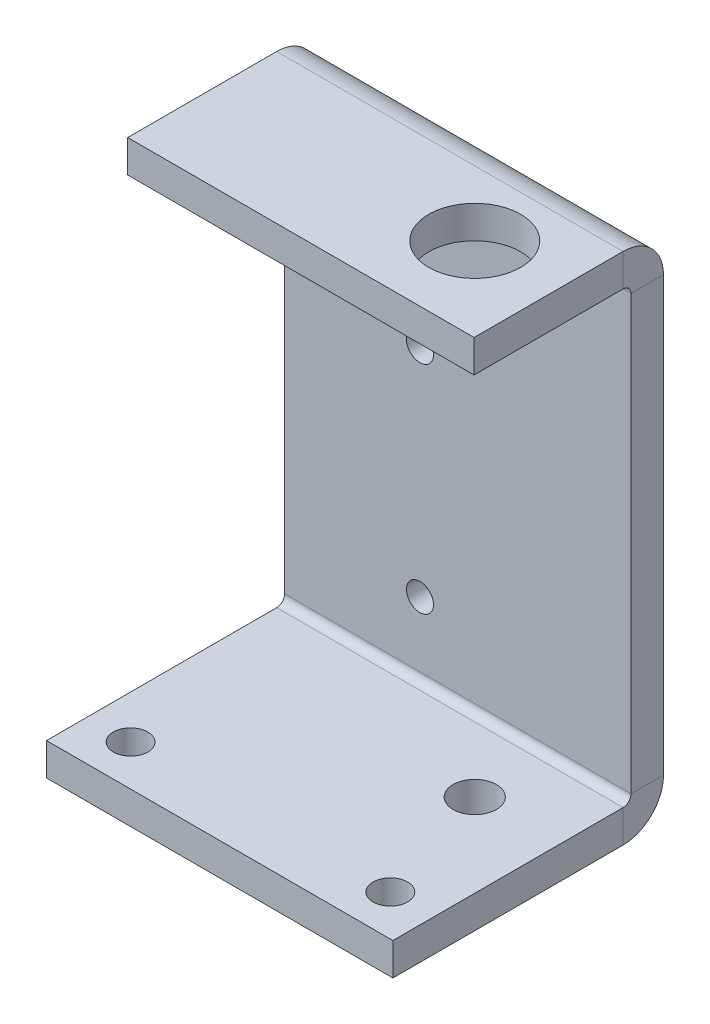
ISO-10303-21;
HEADER;
FILE_DESCRIPTION(('STEP AP214'),'2;1');
FILE_NAME('part.step','',(''),(''),'','','');
FILE_SCHEMA(('AUTOMOTIVE_DESIGN { 1 0 10303 214 1 1 1 1 }'));
ENDSEC;
DATA;
#1=APPLICATION_CONTEXT('core data for automotive mechanical design processes');
#2=APPLICATION_PROTOCOL_DEFINITION('international standard','automotive_design',2000,#1);
#3=PRODUCT_CONTEXT('',#1,'mechanical');
#4=PRODUCT('Part','Part','',(#3));
#5=PRODUCT_RELATED_PRODUCT_CATEGORY('part','',(#4));
#6=PRODUCT_DEFINITION_FORMATION('','',#4);
#7=PRODUCT_DEFINITION_CONTEXT('part definition',#1,'design');
#8=PRODUCT_DEFINITION('design','',#6,#7);
#9=PRODUCT_DEFINITION_SHAPE('','',#8);
#10=(LENGTH_UNIT() NAMED_UNIT(*) SI_UNIT(.MILLI.,.METRE.));
#11=(NAMED_UNIT(*) PLANE_ANGLE_UNIT() SI_UNIT($,.RADIAN.));
#12=(NAMED_UNIT(*) SI_UNIT($,.STERADIAN.) SOLID_ANGLE_UNIT());
#13=UNCERTAINTY_MEASURE_WITH_UNIT(LENGTH_MEASURE(1.E-05),#10,'distance_accuracy_value','');
#14=(GEOMETRIC_REPRESENTATION_CONTEXT(3) GLOBAL_UNCERTAINTY_ASSIGNED_CONTEXT((#13)) GLOBAL_UNIT_ASSIGNED_CONTEXT((#10,
#11,#12)) REPRESENTATION_CONTEXT('',''));
#15=CARTESIAN_POINT('',(0.,0.,0.));
#16=DIRECTION('',(0.,0.,1.));
#17=DIRECTION('',(1.,0.,0.));
#18=AXIS2_PLACEMENT_3D('',#15,#16,#17);
#19=CARTESIAN_POINT('',(-16.,44.5,-12.5000000000002));
#20=DIRECTION('',(1.,0.,0.));
#21=DIRECTION('',(0.,1.,0.));
#22=AXIS2_PLACEMENT_3D('',#19,#20,#21);
#23=PLANE('',#22);
#24=DIRECTION('',(0.,0.,-1.));
#25=VECTOR('',#24,1.);
#26=CARTESIAN_POINT('',(-16.,40.7634,-9.50000000000015));
#27=LINE('',#26,#25);
#28=CARTESIAN_POINT('',(-16.,40.7634,-9.50000000000014));
#29=VERTEX_POINT('',#28);
#30=CARTESIAN_POINT('',(-16.,40.7634,-12.5000000000001));
#31=VERTEX_POINT('',#30);
#32=EDGE_CURVE('E218',#29,#31,#27,.T.);
#33=ORIENTED_EDGE('',*,*,#32,.T.);
#34=DIRECTION('',(0.,1.,0.));
#35=VECTOR('',#34,1.);
#36=CARTESIAN_POINT('',(-16.,0.,-12.5));
#37=LINE('',#36,#35);
#38=CARTESIAN_POINT('',(-16.,0.736600000000018,-12.5));
#39=VERTEX_POINT('',#38);
#40=EDGE_CURVE('E237',#39,#31,#37,.T.);
#41=ORIENTED_EDGE('',*,*,#40,.F.);
#42=DIRECTION('',(0.,0.,1.));
#43=VECTOR('',#42,1.);
#44=CARTESIAN_POINT('',(-16.,0.736599999999997,-9.5));
#45=LINE('',#44,#43);
#46=CARTESIAN_POINT('',(-16.,0.736599999999989,-9.5));
#47=VERTEX_POINT('',#46);
#48=EDGE_CURVE('E246',#47,#39,#45,.F.);
#49=ORIENTED_EDGE('',*,*,#48,.F.);
#50=DIRECTION('',(0.,-1.,0.));
#51=VECTOR('',#50,1.);
#52=CARTESIAN_POINT('',(-16.,44.5,-9.50000000000015));
#53=LINE('',#52,#51);
#54=EDGE_CURVE('E241',#47,#29,#53,.F.);
#55=ORIENTED_EDGE('',*,*,#54,.T.);
#56=EDGE_LOOP('',(#33,#41,#49,#55));
#57=FACE_BOUND('',#56,.T.);
#58=ADVANCED_FACE('F78',(#57),#23,.F.);
#59=CARTESIAN_POINT('',(16.,0.,-12.5));
#60=DIRECTION('',(-1.,0.,0.));
#61=DIRECTION('',(0.,0.,1.));
#62=AXIS2_PLACEMENT_3D('',#59,#60,#61);
#63=PLANE('',#62);
#64=DIRECTION('',(0.,0.,-1.));
#65=VECTOR('',#64,1.);
#66=CARTESIAN_POINT('',(16.,40.7634,-9.50000000000015));
#67=LINE('',#66,#65);
#68=CARTESIAN_POINT('',(16.,40.7634,-9.50000000000015));
#69=VERTEX_POINT('',#68);
#70=CARTESIAN_POINT('',(16.,40.7634,-12.5000000000001));
#71=VERTEX_POINT('',#70);
#72=EDGE_CURVE('E228',#69,#71,#67,.T.);
#73=ORIENTED_EDGE('',*,*,#72,.F.);
#74=DIRECTION('',(0.,1.,0.));
#75=VECTOR('',#74,1.);
#76=CARTESIAN_POINT('',(16.,0.,-9.5));
#77=LINE('',#76,#75);
#78=CARTESIAN_POINT('',(16.,0.736599999999989,-9.5));
#79=VERTEX_POINT('',#78);
#80=EDGE_CURVE('E239',#69,#79,#77,.F.);
#81=ORIENTED_EDGE('',*,*,#80,.T.);
#82=DIRECTION('',(0.,0.,1.));
#83=VECTOR('',#82,1.);
#84=CARTESIAN_POINT('',(16.,0.736600000000018,-12.5));
#85=LINE('',#84,#83);
#86=CARTESIAN_POINT('',(16.,0.736599999999979,-12.5));
#87=VERTEX_POINT('',#86);
#88=EDGE_CURVE('E231',#79,#87,#85,.F.);
#89=ORIENTED_EDGE('',*,*,#88,.T.);
#90=DIRECTION('',(0.,-1.,0.));
#91=VECTOR('',#90,1.);
#92=CARTESIAN_POINT('',(16.,0.,-12.5));
#93=LINE('',#92,#91);
#94=EDGE_CURVE('E234',#71,#87,#93,.T.);
#95=ORIENTED_EDGE('',*,*,#94,.F.);
#96=EDGE_LOOP('',(#73,#81,#89,#95));
#97=FACE_BOUND('',#96,.T.);
#98=ADVANCED_FACE('F302',(#97),#63,.F.);
#99=CARTESIAN_POINT('',(0.,0.,-12.5));
#100=DIRECTION('',(0.,0.,1.));
#101=DIRECTION('',(0.,-1.,0.));
#102=AXIS2_PLACEMENT_3D('',#99,#100,#101);
#103=PLANE('',#102);
#104=CARTESIAN_POINT('',(-3.5,6.73659999999999,-12.5000000000002));
#105=DIRECTION('',(0.,0.,1.));
#106=DIRECTION('',(1.,0.,0.));
#107=AXIS2_PLACEMENT_3D('',#104,#105,#106);
#108=CIRCLE('',#107,1.25);
#109=CARTESIAN_POINT('',(-2.25,6.73659999999999,-12.5000000000002));
#110=VERTEX_POINT('',#109);
#111=EDGE_CURVE('E325',#110,#110,#108,.T.);
#112=ORIENTED_EDGE('',*,*,#111,.T.);
#113=EDGE_LOOP('',(#112));
#114=FACE_BOUND('',#113,.T.);
#115=CARTESIAN_POINT('',(-3.5,26.7366,-12.5000000000002));
#116=DIRECTION('',(0.,0.,1.));
#117=DIRECTION('',(1.,0.,0.));
#118=AXIS2_PLACEMENT_3D('',#115,#116,#117);
#119=CIRCLE('',#118,1.25);
#120=CARTESIAN_POINT('',(-2.25,26.7366,-12.5000000000002));
#121=VERTEX_POINT('',#120);
#122=EDGE_CURVE('E211',#121,#121,#119,.T.);
#123=ORIENTED_EDGE('',*,*,#122,.T.);
#124=EDGE_LOOP('',(#123));
#125=FACE_BOUND('',#124,.T.);
#126=DIRECTION('',(-1.,0.,0.));
#127=VECTOR('',#126,1.);
#128=CARTESIAN_POINT('',(-16.,40.7634,-12.5000000000001));
#129=LINE('',#128,#127);
#130=EDGE_CURVE('E212',#31,#71,#129,.F.);
#131=ORIENTED_EDGE('',*,*,#130,.T.);
#132=ORIENTED_EDGE('',*,*,#94,.T.);
#133=DIRECTION('',(-1.,0.,0.));
#134=VECTOR('',#133,1.);
#135=CARTESIAN_POINT('',(16.,0.736600000000018,-12.5));
#136=LINE('',#135,#134);
#137=EDGE_CURVE('E243',#39,#87,#136,.F.);
#138=ORIENTED_EDGE('',*,*,#137,.F.);
#139=ORIENTED_EDGE('',*,*,#40,.T.);
#140=EDGE_LOOP('',(#131,#132,#138,#139));
#141=FACE_BOUND('',#140,.T.);
#142=ADVANCED_FACE('F389',(#114,#125,#141),#103,.F.);
#143=CARTESIAN_POINT('',(0.,0.,-9.5));
#144=DIRECTION('',(0.,0.,1.));
#145=DIRECTION('',(0.,-1.,0.));
#146=AXIS2_PLACEMENT_3D('',#143,#144,#145);
#147=PLANE('',#146);
#148=CARTESIAN_POINT('',(-3.5,6.73659999999999,-9.5));
#149=DIRECTION('',(0.,0.,1.));
#150=DIRECTION('',(1.,0.,0.));
#151=AXIS2_PLACEMENT_3D('',#148,#149,#150);
#152=CIRCLE('',#151,1.25);
#153=CARTESIAN_POINT('',(-2.25,6.73659999999999,-9.5));
#154=VERTEX_POINT('',#153);
#155=EDGE_CURVE('E328',#154,#154,#152,.T.);
#156=ORIENTED_EDGE('',*,*,#155,.F.);
#157=EDGE_LOOP('',(#156));
#158=FACE_BOUND('',#157,.T.);
#159=CARTESIAN_POINT('',(-3.5,26.7366,-9.5));
#160=DIRECTION('',(0.,0.,1.));
#161=DIRECTION('',(1.,0.,0.));
#162=AXIS2_PLACEMENT_3D('',#159,#160,#161);
#163=CIRCLE('',#162,1.25);
#164=CARTESIAN_POINT('',(-2.25,26.7366,-9.5));
#165=VERTEX_POINT('',#164);
#166=EDGE_CURVE('E322',#165,#165,#163,.T.);
#167=ORIENTED_EDGE('',*,*,#166,.F.);
#168=EDGE_LOOP('',(#167));
#169=FACE_BOUND('',#168,.T.);
#170=ORIENTED_EDGE('',*,*,#80,.F.);
#171=DIRECTION('',(-1.,0.,0.));
#172=VECTOR('',#171,1.);
#173=CARTESIAN_POINT('',(-16.,40.7634,-9.50000000000015));
#174=LINE('',#173,#172);
#175=EDGE_CURVE('E93',#29,#69,#174,.F.);
#176=ORIENTED_EDGE('',*,*,#175,.F.);
#177=ORIENTED_EDGE('',*,*,#54,.F.);
#178=DIRECTION('',(-1.,0.,0.));
#179=VECTOR('',#178,1.);
#180=CARTESIAN_POINT('',(16.,0.736599999999997,-9.5));
#181=LINE('',#180,#179);
#182=EDGE_CURVE('E249',#79,#47,#181,.T.);
#183=ORIENTED_EDGE('',*,*,#182,.F.);
#184=EDGE_LOOP('',(#170,#176,#177,#183));
#185=FACE_BOUND('',#184,.T.);
#186=ADVANCED_FACE('F303',(#158,#169,#185),#147,.T.);
#187=CARTESIAN_POINT('',(-16.,-3.,12.5));
#188=DIRECTION('',(-1.,0.,0.));
#189=DIRECTION('',(0.,0.,1.));
#190=AXIS2_PLACEMENT_3D('',#187,#188,#189);
#191=PLANE('',#190);
#192=DIRECTION('',(0.,0.,1.));
#193=VECTOR('',#192,1.);
#194=CARTESIAN_POINT('',(-16.,0.,12.5));
#195=LINE('',#194,#193);
#196=CARTESIAN_POINT('',(-16.,0.,-8.7634));
#197=VERTEX_POINT('',#196);
#198=CARTESIAN_POINT('',(-16.,0.,12.5));
#199=VERTEX_POINT('',#198);
#200=EDGE_CURVE('E271',#197,#199,#195,.T.);
#201=ORIENTED_EDGE('',*,*,#200,.F.);
#202=DIRECTION('',(0.,-1.,0.));
#203=VECTOR('',#202,1.);
#204=CARTESIAN_POINT('',(-16.,0.,-8.7634));
#205=LINE('',#204,#203);
#206=CARTESIAN_POINT('',(-16.,-3.00000000000001,-8.76339999999999));
#207=VERTEX_POINT('',#206);
#208=EDGE_CURVE('E259',#197,#207,#205,.T.);
#209=ORIENTED_EDGE('',*,*,#208,.T.);
#210=DIRECTION('',(0.,0.,1.));
#211=VECTOR('',#210,1.);
#212=CARTESIAN_POINT('',(-16.,-3.,12.5));
#213=LINE('',#212,#211);
#214=CARTESIAN_POINT('',(-16.,-3.,12.5));
#215=VERTEX_POINT('',#214);
#216=EDGE_CURVE('E274',#207,#215,#213,.T.);
#217=ORIENTED_EDGE('',*,*,#216,.T.);
#218=DIRECTION('',(0.,1.,0.));
#219=VECTOR('',#218,1.);
#220=CARTESIAN_POINT('',(-16.,-3.,12.5));
#221=LINE('',#220,#219);
#222=EDGE_CURVE('E82',#215,#199,#221,.T.);
#223=ORIENTED_EDGE('',*,*,#222,.T.);
#224=EDGE_LOOP('',(#201,#209,#217,#223));
#225=FACE_BOUND('',#224,.T.);
#226=ADVANCED_FACE('F80',(#225),#191,.T.);
#227=CARTESIAN_POINT('',(0.,-3.,0.));
#228=DIRECTION('',(0.,1.,0.));
#229=DIRECTION('',(0.,0.,1.));
#230=AXIS2_PLACEMENT_3D('',#227,#228,#229);
#231=PLANE('',#230);
#232=CARTESIAN_POINT('',(8.30000000000001,-3.,-2.76340000000014));
#233=DIRECTION('',(0.,1.,0.));
#234=DIRECTION('',(0.,0.,1.));
#235=AXIS2_PLACEMENT_3D('',#232,#233,#234);
#236=CIRCLE('',#235,2.);
#237=CARTESIAN_POINT('',(8.30000000000001,-3.,-0.76340000000014));
#238=VERTEX_POINT('',#237);
#239=EDGE_CURVE('E349',#238,#238,#236,.T.);
#240=ORIENTED_EDGE('',*,*,#239,.T.);
#241=EDGE_LOOP('',(#240));
#242=FACE_BOUND('',#241,.T.);
#243=CARTESIAN_POINT('',(-12.,-3.,8.73659999999983));
#244=DIRECTION('',(0.,1.,0.));
#245=DIRECTION('',(0.,0.,1.));
#246=AXIS2_PLACEMENT_3D('',#243,#244,#245);
#247=CIRCLE('',#246,1.6);
#248=CARTESIAN_POINT('',(-12.,-3.,10.3365999999998));
#249=VERTEX_POINT('',#248);
#250=EDGE_CURVE('E343',#249,#249,#247,.T.);
#251=ORIENTED_EDGE('',*,*,#250,.T.);
#252=EDGE_LOOP('',(#251));
#253=FACE_BOUND('',#252,.T.);
#254=CARTESIAN_POINT('',(12.,-3.,8.73659999999983));
#255=DIRECTION('',(0.,1.,0.));
#256=DIRECTION('',(0.,0.,1.));
#257=AXIS2_PLACEMENT_3D('',#254,#255,#256);
#258=CIRCLE('',#257,1.6);
#259=CARTESIAN_POINT('',(12.,-3.,10.3365999999998));
#260=VERTEX_POINT('',#259);
#261=EDGE_CURVE('E337',#260,#260,#258,.T.);
#262=ORIENTED_EDGE('',*,*,#261,.T.);
#263=EDGE_LOOP('',(#262));
#264=FACE_BOUND('',#263,.T.);
#265=DIRECTION('',(-1.,0.,0.));
#266=VECTOR('',#265,1.);
#267=CARTESIAN_POINT('',(-16.,-3.00000000000001,-8.76339999999999));
#268=LINE('',#267,#266);
#269=CARTESIAN_POINT('',(16.,-3.,-8.7634));
#270=VERTEX_POINT('',#269);
#271=EDGE_CURVE('E253',#207,#270,#268,.F.);
#272=ORIENTED_EDGE('',*,*,#271,.T.);
#273=DIRECTION('',(0.,0.,-1.));
#274=VECTOR('',#273,1.);
#275=CARTESIAN_POINT('',(16.,-3.,12.5));
#276=LINE('',#275,#274);
#277=CARTESIAN_POINT('',(16.,-3.,12.5));
#278=VERTEX_POINT('',#277);
#279=EDGE_CURVE('E280',#278,#270,#276,.T.);
#280=ORIENTED_EDGE('',*,*,#279,.F.);
#281=DIRECTION('',(1.,0.,0.));
#282=VECTOR('',#281,1.);
#283=CARTESIAN_POINT('',(16.,-3.,12.5));
#284=LINE('',#283,#282);
#285=EDGE_CURVE('E276',#215,#278,#284,.T.);
#286=ORIENTED_EDGE('',*,*,#285,.F.);
#287=ORIENTED_EDGE('',*,*,#216,.F.);
#288=EDGE_LOOP('',(#272,#280,#286,#287));
#289=FACE_BOUND('',#288,.T.);
#290=ADVANCED_FACE('F361',(#242,#253,#264,#289),#231,.F.);
#291=CARTESIAN_POINT('',(0.,0.,0.));
#292=DIRECTION('',(0.,1.,0.));
#293=DIRECTION('',(0.,0.,1.));
#294=AXIS2_PLACEMENT_3D('',#291,#292,#293);
#295=PLANE('',#294);
#296=CARTESIAN_POINT('',(8.30000000000001,0.,-2.76340000000014));
#297=DIRECTION('',(0.,1.,0.));
#298=DIRECTION('',(0.,0.,1.));
#299=AXIS2_PLACEMENT_3D('',#296,#297,#298);
#300=CIRCLE('',#299,2.);
#301=CARTESIAN_POINT('',(8.30000000000001,0.,-0.76340000000014));
#302=VERTEX_POINT('',#301);
#303=EDGE_CURVE('E352',#302,#302,#300,.T.);
#304=ORIENTED_EDGE('',*,*,#303,.F.);
#305=EDGE_LOOP('',(#304));
#306=FACE_BOUND('',#305,.T.);
#307=CARTESIAN_POINT('',(-12.,0.,8.73659999999983));
#308=DIRECTION('',(0.,1.,0.));
#309=DIRECTION('',(0.,0.,1.));
#310=AXIS2_PLACEMENT_3D('',#307,#308,#309);
#311=CIRCLE('',#310,1.59999999999999);
#312=CARTESIAN_POINT('',(-12.,0.,10.3365999999998));
#313=VERTEX_POINT('',#312);
#314=EDGE_CURVE('E346',#313,#313,#311,.T.);
#315=ORIENTED_EDGE('',*,*,#314,.F.);
#316=EDGE_LOOP('',(#315));
#317=FACE_BOUND('',#316,.T.);
#318=CARTESIAN_POINT('',(12.,0.,8.73659999999983));
#319=DIRECTION('',(0.,1.,0.));
#320=DIRECTION('',(0.,0.,1.));
#321=AXIS2_PLACEMENT_3D('',#318,#319,#320);
#322=CIRCLE('',#321,1.59999999999999);
#323=CARTESIAN_POINT('',(12.,0.,10.3365999999998));
#324=VERTEX_POINT('',#323);
#325=EDGE_CURVE('E340',#324,#324,#322,.T.);
#326=ORIENTED_EDGE('',*,*,#325,.F.);
#327=EDGE_LOOP('',(#326));
#328=FACE_BOUND('',#327,.T.);
#329=DIRECTION('',(0.,0.,-1.));
#330=VECTOR('',#329,1.);
#331=CARTESIAN_POINT('',(16.,0.,12.5));
#332=LINE('',#331,#330);
#333=CARTESIAN_POINT('',(16.,0.,12.5));
#334=VERTEX_POINT('',#333);
#335=CARTESIAN_POINT('',(16.,0.,-8.7634));
#336=VERTEX_POINT('',#335);
#337=EDGE_CURVE('E277',#334,#336,#332,.T.);
#338=ORIENTED_EDGE('',*,*,#337,.T.);
#339=DIRECTION('',(-1.,0.,0.));
#340=VECTOR('',#339,1.);
#341=CARTESIAN_POINT('',(-16.,0.,-8.7634));
#342=LINE('',#341,#340);
#343=EDGE_CURVE('E101',#197,#336,#342,.F.);
#344=ORIENTED_EDGE('',*,*,#343,.F.);
#345=ORIENTED_EDGE('',*,*,#200,.T.);
#346=DIRECTION('',(1.,0.,0.));
#347=VECTOR('',#346,1.);
#348=CARTESIAN_POINT('',(16.,0.,12.5));
#349=LINE('',#348,#347);
#350=EDGE_CURVE('E284',#199,#334,#349,.T.);
#351=ORIENTED_EDGE('',*,*,#350,.T.);
#352=EDGE_LOOP('',(#338,#344,#345,#351));
#353=FACE_BOUND('',#352,.T.);
#354=ADVANCED_FACE('F288',(#306,#317,#328,#353),#295,.T.);
#355=CARTESIAN_POINT('',(16.,-3.,12.5));
#356=DIRECTION('',(1.,0.,0.));
#357=DIRECTION('',(0.,0.,-1.));
#358=AXIS2_PLACEMENT_3D('',#355,#356,#357);
#359=PLANE('',#358);
#360=DIRECTION('',(0.,-1.,0.));
#361=VECTOR('',#360,1.);
#362=CARTESIAN_POINT('',(16.,0.,-8.7634));
#363=LINE('',#362,#361);
#364=EDGE_CURVE('E268',#336,#270,#363,.T.);
#365=ORIENTED_EDGE('',*,*,#364,.F.);
#366=ORIENTED_EDGE('',*,*,#337,.F.);
#367=DIRECTION('',(0.,1.,0.));
#368=VECTOR('',#367,1.);
#369=CARTESIAN_POINT('',(16.,-3.,12.5));
#370=LINE('',#369,#368);
#371=EDGE_CURVE('E13',#278,#334,#370,.T.);
#372=ORIENTED_EDGE('',*,*,#371,.F.);
#373=ORIENTED_EDGE('',*,*,#279,.T.);
#374=EDGE_LOOP('',(#365,#366,#372,#373));
#375=FACE_BOUND('',#374,.T.);
#376=ADVANCED_FACE('F360',(#375),#359,.T.);
#377=CARTESIAN_POINT('',(16.,-3.,12.5));
#378=DIRECTION('',(0.,0.,1.));
#379=DIRECTION('',(1.,0.,0.));
#380=AXIS2_PLACEMENT_3D('',#377,#378,#379);
#381=PLANE('',#380);
#382=ORIENTED_EDGE('',*,*,#350,.F.);
#383=ORIENTED_EDGE('',*,*,#222,.F.);
#384=ORIENTED_EDGE('',*,*,#285,.T.);
#385=ORIENTED_EDGE('',*,*,#371,.T.);
#386=EDGE_LOOP('',(#382,#383,#384,#385));
#387=FACE_BOUND('',#386,.T.);
#388=ADVANCED_FACE('F402',(#387),#381,.T.);
#389=CARTESIAN_POINT('',(16.,0.736599999999992,-8.7634));
#390=DIRECTION('',(1.,0.,0.));
#391=DIRECTION('',(0.,0.,-1.));
#392=AXIS2_PLACEMENT_3D('',#389,#390,#391);
#393=PLANE('',#392);
#394=ORIENTED_EDGE('',*,*,#88,.F.);
#395=CARTESIAN_POINT('',(16.,0.736599999999992,-8.7634));
#396=DIRECTION('',(-1.,0.,0.));
#397=DIRECTION('',(0.,0.,1.));
#398=AXIS2_PLACEMENT_3D('',#395,#396,#397);
#399=CIRCLE('',#398,0.736600000000002);
#400=EDGE_CURVE('E262',#336,#79,#399,.F.);
#401=ORIENTED_EDGE('',*,*,#400,.F.);
#402=ORIENTED_EDGE('',*,*,#364,.T.);
#403=CARTESIAN_POINT('',(16.,0.736599999999992,-8.7634));
#404=DIRECTION('',(-1.,0.,0.));
#405=DIRECTION('',(0.,0.,1.));
#406=AXIS2_PLACEMENT_3D('',#403,#404,#405);
#407=CIRCLE('',#406,3.7366);
#408=EDGE_CURVE('E255',#270,#87,#407,.F.);
#409=ORIENTED_EDGE('',*,*,#408,.T.);
#410=EDGE_LOOP('',(#394,#401,#402,#409));
#411=FACE_BOUND('',#410,.T.);
#412=ADVANCED_FACE('F298',(#411),#393,.T.);
#413=CARTESIAN_POINT('',(-16.,0.736599999999992,-8.7634));
#414=DIRECTION('',(1.,0.,0.));
#415=DIRECTION('',(0.,0.,-1.));
#416=AXIS2_PLACEMENT_3D('',#413,#414,#415);
#417=PLANE('',#416);
#418=CARTESIAN_POINT('',(-16.,0.736599999999992,-8.7634));
#419=DIRECTION('',(-1.,0.,0.));
#420=DIRECTION('',(0.,0.,1.));
#421=AXIS2_PLACEMENT_3D('',#418,#419,#420);
#422=CIRCLE('',#421,0.736600000000002);
#423=EDGE_CURVE('E236',#47,#197,#422,.T.);
#424=ORIENTED_EDGE('',*,*,#423,.F.);
#425=ORIENTED_EDGE('',*,*,#48,.T.);
#426=CARTESIAN_POINT('',(-16.,0.736599999999992,-8.7634));
#427=DIRECTION('',(-1.,0.,0.));
#428=DIRECTION('',(0.,0.,1.));
#429=AXIS2_PLACEMENT_3D('',#426,#427,#428);
#430=CIRCLE('',#429,3.7366);
#431=EDGE_CURVE('E256',#39,#207,#430,.T.);
#432=ORIENTED_EDGE('',*,*,#431,.T.);
#433=ORIENTED_EDGE('',*,*,#208,.F.);
#434=EDGE_LOOP('',(#424,#425,#432,#433));
#435=FACE_BOUND('',#434,.T.);
#436=ADVANCED_FACE('F396',(#435),#417,.F.);
#437=CARTESIAN_POINT('',(-16.,0.736599999999992,-8.7634));
#438=DIRECTION('',(-1.,0.,0.));
#439=DIRECTION('',(0.,0.,-1.));
#440=AXIS2_PLACEMENT_3D('',#437,#438,#439);
#441=CYLINDRICAL_SURFACE('',#440,3.7366);
#442=ORIENTED_EDGE('',*,*,#271,.F.);
#443=ORIENTED_EDGE('',*,*,#431,.F.);
#444=ORIENTED_EDGE('',*,*,#137,.T.);
#445=ORIENTED_EDGE('',*,*,#408,.F.);
#446=EDGE_LOOP('',(#442,#443,#444,#445));
#447=FACE_BOUND('',#446,.T.);
#448=ADVANCED_FACE('F393',(#447),#441,.T.);
#449=CARTESIAN_POINT('',(-16.,0.736599999999992,-8.7634));
#450=DIRECTION('',(-1.,0.,0.));
#451=DIRECTION('',(0.,0.,-1.));
#452=AXIS2_PLACEMENT_3D('',#449,#450,#451);
#453=CYLINDRICAL_SURFACE('',#452,0.736600000000002);
#454=ORIENTED_EDGE('',*,*,#343,.T.);
#455=ORIENTED_EDGE('',*,*,#400,.T.);
#456=ORIENTED_EDGE('',*,*,#182,.T.);
#457=ORIENTED_EDGE('',*,*,#423,.T.);
#458=EDGE_LOOP('',(#454,#455,#456,#457));
#459=FACE_BOUND('',#458,.T.);
#460=ADVANCED_FACE('F293',(#459),#453,.F.);
#461=CARTESIAN_POINT('',(16.,40.7634,-8.76340000000014));
#462=DIRECTION('',(1.,0.,0.));
#463=DIRECTION('',(0.,0.,-1.));
#464=AXIS2_PLACEMENT_3D('',#461,#462,#463);
#465=PLANE('',#464);
#466=DIRECTION('',(0.,-1.,0.));
#467=VECTOR('',#466,1.);
#468=CARTESIAN_POINT('',(16.,44.5,-8.76340000000017));
#469=LINE('',#468,#467);
#470=CARTESIAN_POINT('',(16.,41.5,-8.76340000000015));
#471=VERTEX_POINT('',#470);
#472=CARTESIAN_POINT('',(16.,44.5,-8.76340000000017));
#473=VERTEX_POINT('',#472);
#474=EDGE_CURVE('E193',#471,#473,#469,.F.);
#475=ORIENTED_EDGE('',*,*,#474,.F.);
#476=CARTESIAN_POINT('',(16.,40.7634,-8.76340000000014));
#477=DIRECTION('',(-1.,0.,0.));
#478=DIRECTION('',(0.,0.,1.));
#479=AXIS2_PLACEMENT_3D('',#476,#477,#478);
#480=CIRCLE('',#479,0.736600000000004);
#481=EDGE_CURVE('E221',#69,#471,#480,.F.);
#482=ORIENTED_EDGE('',*,*,#481,.F.);
#483=ORIENTED_EDGE('',*,*,#72,.T.);
#484=CARTESIAN_POINT('',(16.,40.7634,-8.76340000000014));
#485=DIRECTION('',(-1.,0.,0.));
#486=DIRECTION('',(0.,0.,1.));
#487=AXIS2_PLACEMENT_3D('',#484,#485,#486);
#488=CIRCLE('',#487,3.7366);
#489=EDGE_CURVE('E214',#71,#473,#488,.F.);
#490=ORIENTED_EDGE('',*,*,#489,.T.);
#491=EDGE_LOOP('',(#475,#482,#483,#490));
#492=FACE_BOUND('',#491,.T.);
#493=ADVANCED_FACE('F310',(#492),#465,.T.);
#494=CARTESIAN_POINT('',(-16.,40.7634,-8.76340000000014));
#495=DIRECTION('',(1.,0.,0.));
#496=DIRECTION('',(0.,0.,-1.));
#497=AXIS2_PLACEMENT_3D('',#494,#495,#496);
#498=PLANE('',#497);
#499=CARTESIAN_POINT('',(-16.,40.7634,-8.76340000000014));
#500=DIRECTION('',(-1.,0.,0.));
#501=DIRECTION('',(0.,0.,1.));
#502=AXIS2_PLACEMENT_3D('',#499,#500,#501);
#503=CIRCLE('',#502,0.736600000000004);
#504=CARTESIAN_POINT('',(-16.,41.5,-8.76340000000015));
#505=VERTEX_POINT('',#504);
#506=EDGE_CURVE('E225',#505,#29,#503,.T.);
#507=ORIENTED_EDGE('',*,*,#506,.F.);
#508=DIRECTION('',(0.,-1.,0.));
#509=VECTOR('',#508,1.);
#510=CARTESIAN_POINT('',(-16.,41.5,-8.76340000000015));
#511=LINE('',#510,#509);
#512=CARTESIAN_POINT('',(-16.,44.5,-8.76340000000017));
#513=VERTEX_POINT('',#512);
#514=EDGE_CURVE('E205',#505,#513,#511,.F.);
#515=ORIENTED_EDGE('',*,*,#514,.T.);
#516=CARTESIAN_POINT('',(-16.,40.7634,-8.76340000000014));
#517=DIRECTION('',(-1.,0.,0.));
#518=DIRECTION('',(0.,0.,1.));
#519=AXIS2_PLACEMENT_3D('',#516,#517,#518);
#520=CIRCLE('',#519,3.7366);
#521=EDGE_CURVE('E215',#513,#31,#520,.T.);
#522=ORIENTED_EDGE('',*,*,#521,.T.);
#523=ORIENTED_EDGE('',*,*,#32,.F.);
#524=EDGE_LOOP('',(#507,#515,#522,#523));
#525=FACE_BOUND('',#524,.T.);
#526=ADVANCED_FACE('F427',(#525),#498,.F.);
#527=CARTESIAN_POINT('',(-16.,40.7634,-8.76340000000014));
#528=DIRECTION('',(-1.,0.,0.));
#529=DIRECTION('',(0.,1.,0.));
#530=AXIS2_PLACEMENT_3D('',#527,#528,#529);
#531=CYLINDRICAL_SURFACE('',#530,3.7366);
#532=ORIENTED_EDGE('',*,*,#130,.F.);
#533=ORIENTED_EDGE('',*,*,#521,.F.);
#534=DIRECTION('',(-1.,0.,0.));
#535=VECTOR('',#534,1.);
#536=CARTESIAN_POINT('',(16.,44.5,-8.76340000000017));
#537=LINE('',#536,#535);
#538=EDGE_CURVE('E203',#513,#473,#537,.F.);
#539=ORIENTED_EDGE('',*,*,#538,.T.);
#540=ORIENTED_EDGE('',*,*,#489,.F.);
#541=EDGE_LOOP('',(#532,#533,#539,#540));
#542=FACE_BOUND('',#541,.T.);
#543=ADVANCED_FACE('F314',(#542),#531,.T.);
#544=CARTESIAN_POINT('',(-16.,40.7634,-8.76340000000014));
#545=DIRECTION('',(-1.,0.,0.));
#546=DIRECTION('',(0.,1.,0.));
#547=AXIS2_PLACEMENT_3D('',#544,#545,#546);
#548=CYLINDRICAL_SURFACE('',#547,0.736600000000004);
#549=ORIENTED_EDGE('',*,*,#175,.T.);
#550=ORIENTED_EDGE('',*,*,#481,.T.);
#551=DIRECTION('',(-1.,0.,0.));
#552=VECTOR('',#551,1.);
#553=CARTESIAN_POINT('',(16.,41.5,-8.76340000000015));
#554=LINE('',#553,#552);
#555=EDGE_CURVE('E208',#471,#505,#554,.T.);
#556=ORIENTED_EDGE('',*,*,#555,.T.);
#557=ORIENTED_EDGE('',*,*,#506,.T.);
#558=EDGE_LOOP('',(#549,#550,#556,#557));
#559=FACE_BOUND('',#558,.T.);
#560=ADVANCED_FACE('F306',(#559),#548,.F.);
#561=CARTESIAN_POINT('',(-16.,44.5000000000001,4.99999999999985));
#562=DIRECTION('',(1.,0.,0.));
#563=DIRECTION('',(0.,0.,-1.));
#564=AXIS2_PLACEMENT_3D('',#561,#562,#563);
#565=PLANE('',#564);
#566=ORIENTED_EDGE('',*,*,#514,.F.);
#567=DIRECTION('',(0.,0.,-1.));
#568=VECTOR('',#567,1.);
#569=CARTESIAN_POINT('',(-16.,41.5000000000001,4.99999999999987));
#570=LINE('',#569,#568);
#571=CARTESIAN_POINT('',(-16.,41.5000000000001,4.99999999999987));
#572=VERTEX_POINT('',#571);
#573=EDGE_CURVE('E201',#505,#572,#570,.F.);
#574=ORIENTED_EDGE('',*,*,#573,.T.);
#575=DIRECTION('',(0.,-1.,0.));
#576=VECTOR('',#575,1.);
#577=CARTESIAN_POINT('',(-16.,44.5000000000001,4.99999999999985));
#578=LINE('',#577,#576);
#579=CARTESIAN_POINT('',(-16.,44.5000000000001,4.99999999999985));
#580=VERTEX_POINT('',#579);
#581=EDGE_CURVE('E189',#580,#572,#578,.T.);
#582=ORIENTED_EDGE('',*,*,#581,.F.);
#583=DIRECTION('',(0.,0.,1.));
#584=VECTOR('',#583,1.);
#585=CARTESIAN_POINT('',(-16.,44.5000000000001,-3.22246125285189E-13));
#586=LINE('',#585,#584);
#587=EDGE_CURVE('E176',#513,#580,#586,.T.);
#588=ORIENTED_EDGE('',*,*,#587,.F.);
#589=EDGE_LOOP('',(#566,#574,#582,#588));
#590=FACE_BOUND('',#589,.T.);
#591=ADVANCED_FACE('F317',(#590),#565,.F.);
#592=CARTESIAN_POINT('',(16.,44.5,-9.50000000000017));
#593=DIRECTION('',(-1.,0.,0.));
#594=DIRECTION('',(0.,-1.,0.));
#595=AXIS2_PLACEMENT_3D('',#592,#593,#594);
#596=PLANE('',#595);
#597=ORIENTED_EDGE('',*,*,#474,.T.);
#598=DIRECTION('',(0.,0.,-1.));
#599=VECTOR('',#598,1.);
#600=CARTESIAN_POINT('',(16.,44.5000000000001,-3.29902835799845E-13));
#601=LINE('',#600,#599);
#602=CARTESIAN_POINT('',(16.,44.5000000000001,4.99999999999985));
#603=VERTEX_POINT('',#602);
#604=EDGE_CURVE('E174',#603,#473,#601,.T.);
#605=ORIENTED_EDGE('',*,*,#604,.F.);
#606=DIRECTION('',(0.,-1.,0.));
#607=VECTOR('',#606,1.);
#608=CARTESIAN_POINT('',(16.,44.5000000000001,4.99999999999985));
#609=LINE('',#608,#607);
#610=CARTESIAN_POINT('',(16.,41.5000000000001,4.99999999999987));
#611=VERTEX_POINT('',#610);
#612=EDGE_CURVE('E182',#603,#611,#609,.T.);
#613=ORIENTED_EDGE('',*,*,#612,.T.);
#614=DIRECTION('',(0.,0.,1.));
#615=VECTOR('',#614,1.);
#616=CARTESIAN_POINT('',(16.,41.5,-9.50000000000015));
#617=LINE('',#616,#615);
#618=EDGE_CURVE('E198',#611,#471,#617,.F.);
#619=ORIENTED_EDGE('',*,*,#618,.T.);
#620=EDGE_LOOP('',(#597,#605,#613,#619));
#621=FACE_BOUND('',#620,.T.);
#622=ADVANCED_FACE('F192',(#621),#596,.F.);
#623=CARTESIAN_POINT('',(0.,44.5000000000001,-3.29902835799845E-13));
#624=DIRECTION('',(0.,-1.,0.));
#625=DIRECTION('',(0.,0.,-1.));
#626=AXIS2_PLACEMENT_3D('',#623,#624,#625);
#627=PLANE('',#626);
#628=CARTESIAN_POINT('',(8.30000000000001,44.5,-2.76340000000014));
#629=DIRECTION('',(0.,1.,0.));
#630=DIRECTION('',(0.,0.,1.));
#631=AXIS2_PLACEMENT_3D('',#628,#629,#630);
#632=CIRCLE('',#631,4.24999999999999);
#633=CARTESIAN_POINT('',(8.30000000000001,44.5000000000001,1.48659999999985));
#634=VERTEX_POINT('',#633);
#635=EDGE_CURVE('E334',#634,#634,#632,.T.);
#636=ORIENTED_EDGE('',*,*,#635,.F.);
#637=EDGE_LOOP('',(#636));
#638=FACE_BOUND('',#637,.T.);
#639=ORIENTED_EDGE('',*,*,#538,.F.);
#640=ORIENTED_EDGE('',*,*,#587,.T.);
#641=DIRECTION('',(1.,0.,0.));
#642=VECTOR('',#641,1.);
#643=CARTESIAN_POINT('',(0.,44.5000000000001,4.99999999999985));
#644=LINE('',#643,#642);
#645=EDGE_CURVE('E169',#580,#603,#644,.T.);
#646=ORIENTED_EDGE('',*,*,#645,.T.);
#647=ORIENTED_EDGE('',*,*,#604,.T.);
#648=EDGE_LOOP('',(#639,#640,#646,#647));
#649=FACE_BOUND('',#648,.T.);
#650=ADVANCED_FACE('F172',(#638,#649),#627,.F.);
#651=CARTESIAN_POINT('',(0.,41.5000000000001,-3.08903103277389E-13));
#652=DIRECTION('',(0.,-1.,0.));
#653=DIRECTION('',(0.,0.,-1.));
#654=AXIS2_PLACEMENT_3D('',#651,#652,#653);
#655=PLANE('',#654);
#656=CARTESIAN_POINT('',(8.30000000000001,41.5,-2.76340000000012));
#657=DIRECTION('',(0.,-1.,0.));
#658=DIRECTION('',(0.,0.,-1.));
#659=AXIS2_PLACEMENT_3D('',#656,#657,#658);
#660=CIRCLE('',#659,4.25);
#661=CARTESIAN_POINT('',(8.30000000000001,41.5,-7.01340000000012));
#662=VERTEX_POINT('',#661);
#663=EDGE_CURVE('E331',#662,#662,#660,.T.);
#664=ORIENTED_EDGE('',*,*,#663,.F.);
#665=EDGE_LOOP('',(#664));
#666=FACE_BOUND('',#665,.T.);
#667=ORIENTED_EDGE('',*,*,#573,.F.);
#668=ORIENTED_EDGE('',*,*,#555,.F.);
#669=ORIENTED_EDGE('',*,*,#618,.F.);
#670=DIRECTION('',(-1.,0.,0.));
#671=VECTOR('',#670,1.);
#672=CARTESIAN_POINT('',(16.,41.5000000000001,4.99999999999987));
#673=LINE('',#672,#671);
#674=EDGE_CURVE('E185',#572,#611,#673,.F.);
#675=ORIENTED_EDGE('',*,*,#674,.F.);
#676=EDGE_LOOP('',(#667,#668,#669,#675));
#677=FACE_BOUND('',#676,.T.);
#678=ADVANCED_FACE('F460',(#666,#677),#655,.T.);
#679=CARTESIAN_POINT('',(16.,44.5000000000001,4.99999999999985));
#680=DIRECTION('',(0.,0.,-1.));
#681=DIRECTION('',(0.,1.,0.));
#682=AXIS2_PLACEMENT_3D('',#679,#680,#681);
#683=PLANE('',#682);
#684=ORIENTED_EDGE('',*,*,#674,.T.);
#685=ORIENTED_EDGE('',*,*,#612,.F.);
#686=ORIENTED_EDGE('',*,*,#645,.F.);
#687=ORIENTED_EDGE('',*,*,#581,.T.);
#688=EDGE_LOOP('',(#684,#685,#686,#687));
#689=FACE_BOUND('',#688,.T.);
#690=ADVANCED_FACE('F183',(#689),#683,.F.);
#691=CARTESIAN_POINT('',(-3.5,26.7366,-9.5));
#692=DIRECTION('',(0.,0.,1.));
#693=DIRECTION('',(1.,0.,0.));
#694=AXIS2_PLACEMENT_3D('',#691,#692,#693);
#695=CYLINDRICAL_SURFACE('',#694,1.25);
#696=ORIENTED_EDGE('',*,*,#122,.F.);
#697=EDGE_LOOP('',(#696));
#698=FACE_BOUND('',#697,.T.);
#699=ORIENTED_EDGE('',*,*,#166,.T.);
#700=EDGE_LOOP('',(#699));
#701=FACE_BOUND('',#700,.T.);
#702=ADVANCED_FACE('F450',(#698,#701),#695,.F.);
#703=CARTESIAN_POINT('',(-3.5,6.73659999999999,-9.5));
#704=DIRECTION('',(0.,0.,1.));
#705=DIRECTION('',(1.,0.,0.));
#706=AXIS2_PLACEMENT_3D('',#703,#704,#705);
#707=CYLINDRICAL_SURFACE('',#706,1.25);
#708=ORIENTED_EDGE('',*,*,#111,.F.);
#709=EDGE_LOOP('',(#708));
#710=FACE_BOUND('',#709,.T.);
#711=ORIENTED_EDGE('',*,*,#155,.T.);
#712=EDGE_LOOP('',(#711));
#713=FACE_BOUND('',#712,.T.);
#714=ADVANCED_FACE('F379',(#710,#713),#707,.F.);
#715=CARTESIAN_POINT('',(8.30000000000001,44.5,-2.76340000000014));
#716=DIRECTION('',(0.,1.,0.));
#717=DIRECTION('',(0.,0.,1.));
#718=AXIS2_PLACEMENT_3D('',#715,#716,#717);
#719=CYLINDRICAL_SURFACE('',#718,4.25);
#720=ORIENTED_EDGE('',*,*,#635,.T.);
#721=EDGE_LOOP('',(#720));
#722=FACE_BOUND('',#721,.T.);
#723=ORIENTED_EDGE('',*,*,#663,.T.);
#724=EDGE_LOOP('',(#723));
#725=FACE_BOUND('',#724,.T.);
#726=ADVANCED_FACE('F370',(#722,#725),#719,.F.);
#727=CARTESIAN_POINT('',(12.,0.,8.73659999999983));
#728=DIRECTION('',(0.,1.,0.));
#729=DIRECTION('',(0.,0.,1.));
#730=AXIS2_PLACEMENT_3D('',#727,#728,#729);
#731=CYLINDRICAL_SURFACE('',#730,1.6);
#732=ORIENTED_EDGE('',*,*,#261,.F.);
#733=EDGE_LOOP('',(#732));
#734=FACE_BOUND('',#733,.T.);
#735=ORIENTED_EDGE('',*,*,#325,.T.);
#736=EDGE_LOOP('',(#735));
#737=FACE_BOUND('',#736,.T.);
#738=ADVANCED_FACE('F367',(#734,#737),#731,.F.);
#739=CARTESIAN_POINT('',(-12.,0.,8.73659999999983));
#740=DIRECTION('',(0.,1.,0.));
#741=DIRECTION('',(0.,0.,1.));
#742=AXIS2_PLACEMENT_3D('',#739,#740,#741);
#743=CYLINDRICAL_SURFACE('',#742,1.6);
#744=ORIENTED_EDGE('',*,*,#250,.F.);
#745=EDGE_LOOP('',(#744));
#746=FACE_BOUND('',#745,.T.);
#747=ORIENTED_EDGE('',*,*,#314,.T.);
#748=EDGE_LOOP('',(#747));
#749=FACE_BOUND('',#748,.T.);
#750=ADVANCED_FACE('F369',(#746,#749),#743,.F.);
#751=CARTESIAN_POINT('',(8.30000000000001,0.,-2.76340000000014));
#752=DIRECTION('',(0.,1.,0.));
#753=DIRECTION('',(0.,0.,1.));
#754=AXIS2_PLACEMENT_3D('',#751,#752,#753);
#755=CYLINDRICAL_SURFACE('',#754,2.);
#756=ORIENTED_EDGE('',*,*,#239,.F.);
#757=EDGE_LOOP('',(#756));
#758=FACE_BOUND('',#757,.T.);
#759=ORIENTED_EDGE('',*,*,#303,.T.);
#760=EDGE_LOOP('',(#759));
#761=FACE_BOUND('',#760,.T.);
#762=ADVANCED_FACE('F356',(#758,#761),#755,.F.);
#763=CLOSED_SHELL('',(#58,#98,#142,#186,#226,#290,#354,#376,#388,#412,#436,#448,#460,#493,#526,
#543,#560,#591,#622,#650,#678,#690,#702,#714,#726,#738,#750,#762));
#764=MANIFOLD_SOLID_BREP('B2',#763);
#765=ADVANCED_BREP_SHAPE_REPRESENTATION('',(#18,#764),#14);
#766=SHAPE_DEFINITION_REPRESENTATION(#9,#765);
ENDSEC;
END-ISO-10303-21;
